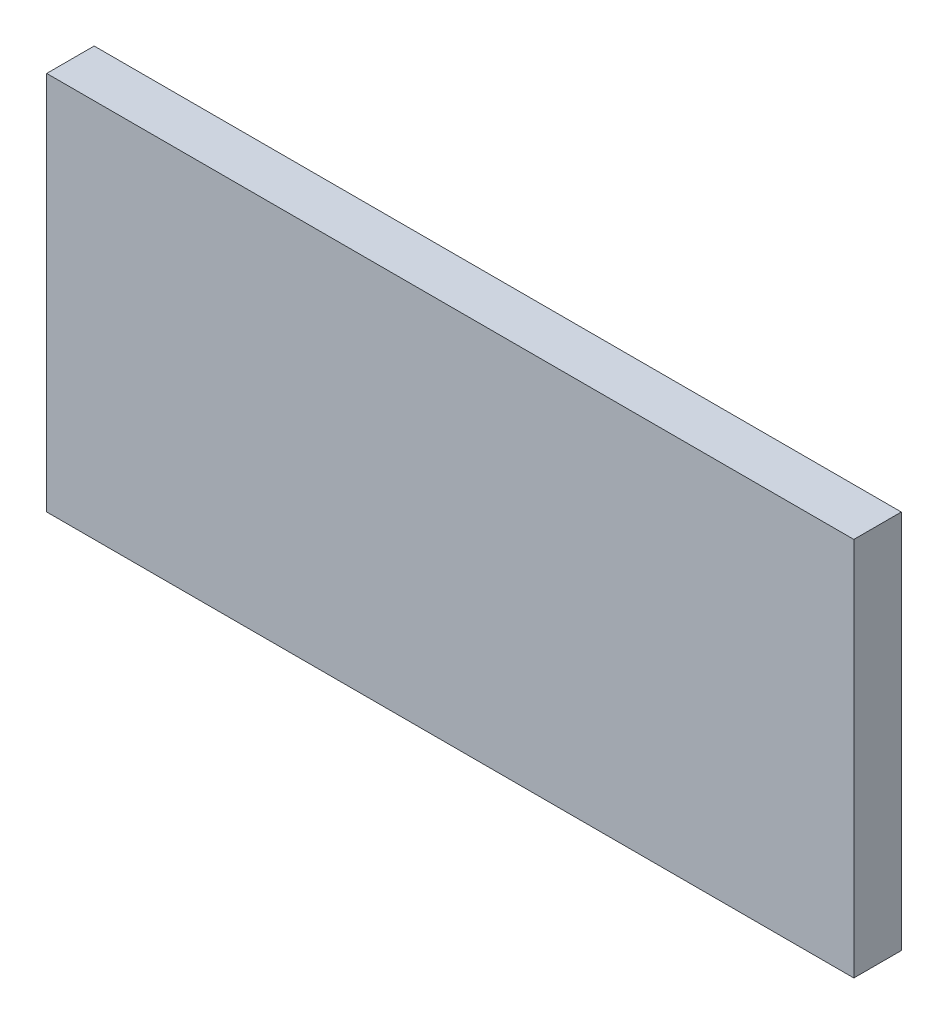
ISO-10303-21;
HEADER;
FILE_DESCRIPTION(('STEP AP214'),'2;1');
FILE_NAME('part.step','',(''),(''),'','','');
FILE_SCHEMA(('AUTOMOTIVE_DESIGN { 1 0 10303 214 1 1 1 1 }'));
ENDSEC;
DATA;
#1=APPLICATION_CONTEXT('core data for automotive mechanical design processes');
#2=APPLICATION_PROTOCOL_DEFINITION('international standard','automotive_design',2000,#1);
#3=PRODUCT_CONTEXT('',#1,'mechanical');
#4=PRODUCT('Part','Part','',(#3));
#5=PRODUCT_RELATED_PRODUCT_CATEGORY('part','',(#4));
#6=PRODUCT_DEFINITION_FORMATION('','',#4);
#7=PRODUCT_DEFINITION_CONTEXT('part definition',#1,'design');
#8=PRODUCT_DEFINITION('design','',#6,#7);
#9=PRODUCT_DEFINITION_SHAPE('','',#8);
#10=(LENGTH_UNIT() NAMED_UNIT(*) SI_UNIT(.MILLI.,.METRE.));
#11=(NAMED_UNIT(*) PLANE_ANGLE_UNIT() SI_UNIT($,.RADIAN.));
#12=(NAMED_UNIT(*) SI_UNIT($,.STERADIAN.) SOLID_ANGLE_UNIT());
#13=UNCERTAINTY_MEASURE_WITH_UNIT(LENGTH_MEASURE(1.E-05),#10,'distance_accuracy_value','');
#14=(GEOMETRIC_REPRESENTATION_CONTEXT(3) GLOBAL_UNCERTAINTY_ASSIGNED_CONTEXT((#13)) GLOBAL_UNIT_ASSIGNED_CONTEXT((#10,
#11,#12)) REPRESENTATION_CONTEXT('',''));
#15=CARTESIAN_POINT('',(0.,0.,0.));
#16=DIRECTION('',(0.,0.,1.));
#17=DIRECTION('',(1.,0.,0.));
#18=AXIS2_PLACEMENT_3D('',#15,#16,#17);
#19=CARTESIAN_POINT('',(42.5,20.,5.));
#20=DIRECTION('',(-1.,0.,0.));
#21=DIRECTION('',(0.,0.,1.));
#22=AXIS2_PLACEMENT_3D('',#19,#20,#21);
#23=PLANE('',#22);
#24=DIRECTION('',(0.,1.,0.));
#25=VECTOR('',#24,1.);
#26=CARTESIAN_POINT('',(42.5,20.,0.));
#27=LINE('',#26,#25);
#28=CARTESIAN_POINT('',(42.5,-20.,0.));
#29=VERTEX_POINT('',#28);
#30=CARTESIAN_POINT('',(42.5,20.,0.));
#31=VERTEX_POINT('',#30);
#32=EDGE_CURVE('E95',#29,#31,#27,.T.);
#33=ORIENTED_EDGE('',*,*,#32,.T.);
#34=DIRECTION('',(0.,0.,-1.));
#35=VECTOR('',#34,1.);
#36=CARTESIAN_POINT('',(42.5,20.,5.));
#37=LINE('',#36,#35);
#38=CARTESIAN_POINT('',(42.5,20.,5.));
#39=VERTEX_POINT('',#38);
#40=EDGE_CURVE('E11',#39,#31,#37,.T.);
#41=ORIENTED_EDGE('',*,*,#40,.F.);
#42=DIRECTION('',(0.,1.,0.));
#43=VECTOR('',#42,1.);
#44=CARTESIAN_POINT('',(42.5,20.,5.));
#45=LINE('',#44,#43);
#46=CARTESIAN_POINT('',(42.5,-20.,5.));
#47=VERTEX_POINT('',#46);
#48=EDGE_CURVE('E83',#47,#39,#45,.T.);
#49=ORIENTED_EDGE('',*,*,#48,.F.);
#50=DIRECTION('',(0.,0.,-1.));
#51=VECTOR('',#50,1.);
#52=CARTESIAN_POINT('',(42.5,-20.,5.));
#53=LINE('',#52,#51);
#54=EDGE_CURVE('E91',#47,#29,#53,.T.);
#55=ORIENTED_EDGE('',*,*,#54,.T.);
#56=EDGE_LOOP('',(#33,#41,#49,#55));
#57=FACE_BOUND('',#56,.T.);
#58=ADVANCED_FACE('F32',(#57),#23,.F.);
#59=CARTESIAN_POINT('',(-42.5,20.,5.));
#60=DIRECTION('',(0.,-1.,0.));
#61=DIRECTION('',(0.,0.,-1.));
#62=AXIS2_PLACEMENT_3D('',#59,#60,#61);
#63=PLANE('',#62);
#64=DIRECTION('',(-1.,0.,0.));
#65=VECTOR('',#64,1.);
#66=CARTESIAN_POINT('',(-42.5,20.,0.));
#67=LINE('',#66,#65);
#68=CARTESIAN_POINT('',(-42.5,20.,0.));
#69=VERTEX_POINT('',#68);
#70=EDGE_CURVE('E87',#31,#69,#67,.T.);
#71=ORIENTED_EDGE('',*,*,#70,.T.);
#72=DIRECTION('',(0.,0.,-1.));
#73=VECTOR('',#72,1.);
#74=CARTESIAN_POINT('',(-42.5,20.,5.));
#75=LINE('',#74,#73);
#76=CARTESIAN_POINT('',(-42.5,20.,5.));
#77=VERTEX_POINT('',#76);
#78=EDGE_CURVE('E40',#77,#69,#75,.T.);
#79=ORIENTED_EDGE('',*,*,#78,.F.);
#80=DIRECTION('',(-1.,0.,0.));
#81=VECTOR('',#80,1.);
#82=CARTESIAN_POINT('',(-42.5,20.,5.));
#83=LINE('',#82,#81);
#84=EDGE_CURVE('E78',#39,#77,#83,.T.);
#85=ORIENTED_EDGE('',*,*,#84,.F.);
#86=ORIENTED_EDGE('',*,*,#40,.T.);
#87=EDGE_LOOP('',(#71,#79,#85,#86));
#88=FACE_BOUND('',#87,.T.);
#89=ADVANCED_FACE('F86',(#88),#63,.F.);
#90=CARTESIAN_POINT('',(-42.5,20.,5.));
#91=DIRECTION('',(1.,0.,0.));
#92=DIRECTION('',(0.,1.,0.));
#93=AXIS2_PLACEMENT_3D('',#90,#91,#92);
#94=PLANE('',#93);
#95=DIRECTION('',(0.,-1.,0.));
#96=VECTOR('',#95,1.);
#97=CARTESIAN_POINT('',(-42.5,20.,0.));
#98=LINE('',#97,#96);
#99=CARTESIAN_POINT('',(-42.5,-20.,0.));
#100=VERTEX_POINT('',#99);
#101=EDGE_CURVE('E65',#69,#100,#98,.T.);
#102=ORIENTED_EDGE('',*,*,#101,.T.);
#103=DIRECTION('',(0.,0.,-1.));
#104=VECTOR('',#103,1.);
#105=CARTESIAN_POINT('',(-42.5,-20.,5.));
#106=LINE('',#105,#104);
#107=CARTESIAN_POINT('',(-42.5,-20.,5.));
#108=VERTEX_POINT('',#107);
#109=EDGE_CURVE('E88',#108,#100,#106,.T.);
#110=ORIENTED_EDGE('',*,*,#109,.F.);
#111=DIRECTION('',(0.,-1.,0.));
#112=VECTOR('',#111,1.);
#113=CARTESIAN_POINT('',(-42.5,20.,5.));
#114=LINE('',#113,#112);
#115=EDGE_CURVE('E81',#77,#108,#114,.T.);
#116=ORIENTED_EDGE('',*,*,#115,.F.);
#117=ORIENTED_EDGE('',*,*,#78,.T.);
#118=EDGE_LOOP('',(#102,#110,#116,#117));
#119=FACE_BOUND('',#118,.T.);
#120=ADVANCED_FACE('F89',(#119),#94,.F.);
#121=CARTESIAN_POINT('',(-42.5,-20.,5.));
#122=DIRECTION('',(0.,1.,0.));
#123=DIRECTION('',(0.,0.,1.));
#124=AXIS2_PLACEMENT_3D('',#121,#122,#123);
#125=PLANE('',#124);
#126=DIRECTION('',(1.,0.,0.));
#127=VECTOR('',#126,1.);
#128=CARTESIAN_POINT('',(-42.5,-20.,0.));
#129=LINE('',#128,#127);
#130=EDGE_CURVE('E71',#100,#29,#129,.T.);
#131=ORIENTED_EDGE('',*,*,#130,.T.);
#132=ORIENTED_EDGE('',*,*,#54,.F.);
#133=DIRECTION('',(1.,0.,0.));
#134=VECTOR('',#133,1.);
#135=CARTESIAN_POINT('',(-42.5,-20.,5.));
#136=LINE('',#135,#134);
#137=EDGE_CURVE('E48',#108,#47,#136,.T.);
#138=ORIENTED_EDGE('',*,*,#137,.F.);
#139=ORIENTED_EDGE('',*,*,#109,.T.);
#140=EDGE_LOOP('',(#131,#132,#138,#139));
#141=FACE_BOUND('',#140,.T.);
#142=ADVANCED_FACE('F102',(#141),#125,.F.);
#143=CARTESIAN_POINT('',(0.,0.,5.));
#144=DIRECTION('',(0.,0.,1.));
#145=DIRECTION('',(1.,0.,0.));
#146=AXIS2_PLACEMENT_3D('',#143,#144,#145);
#147=PLANE('',#146);
#148=ORIENTED_EDGE('',*,*,#48,.T.);
#149=ORIENTED_EDGE('',*,*,#84,.T.);
#150=ORIENTED_EDGE('',*,*,#115,.T.);
#151=ORIENTED_EDGE('',*,*,#137,.T.);
#152=EDGE_LOOP('',(#148,#149,#150,#151));
#153=FACE_BOUND('',#152,.T.);
#154=ADVANCED_FACE('F79',(#153),#147,.T.);
#155=CARTESIAN_POINT('',(0.,0.,0.));
#156=DIRECTION('',(0.,0.,1.));
#157=DIRECTION('',(1.,0.,0.));
#158=AXIS2_PLACEMENT_3D('',#155,#156,#157);
#159=PLANE('',#158);
#160=ORIENTED_EDGE('',*,*,#32,.F.);
#161=ORIENTED_EDGE('',*,*,#130,.F.);
#162=ORIENTED_EDGE('',*,*,#101,.F.);
#163=ORIENTED_EDGE('',*,*,#70,.F.);
#164=EDGE_LOOP('',(#160,#161,#162,#163));
#165=FACE_BOUND('',#164,.T.);
#166=ADVANCED_FACE('F105',(#165),#159,.F.);
#167=CLOSED_SHELL('',(#58,#89,#120,#142,#154,#166));
#168=MANIFOLD_SOLID_BREP('B2',#167);
#169=ADVANCED_BREP_SHAPE_REPRESENTATION('',(#18,#168),#14);
#170=SHAPE_DEFINITION_REPRESENTATION(#9,#169);
ENDSEC;
END-ISO-10303-21;
